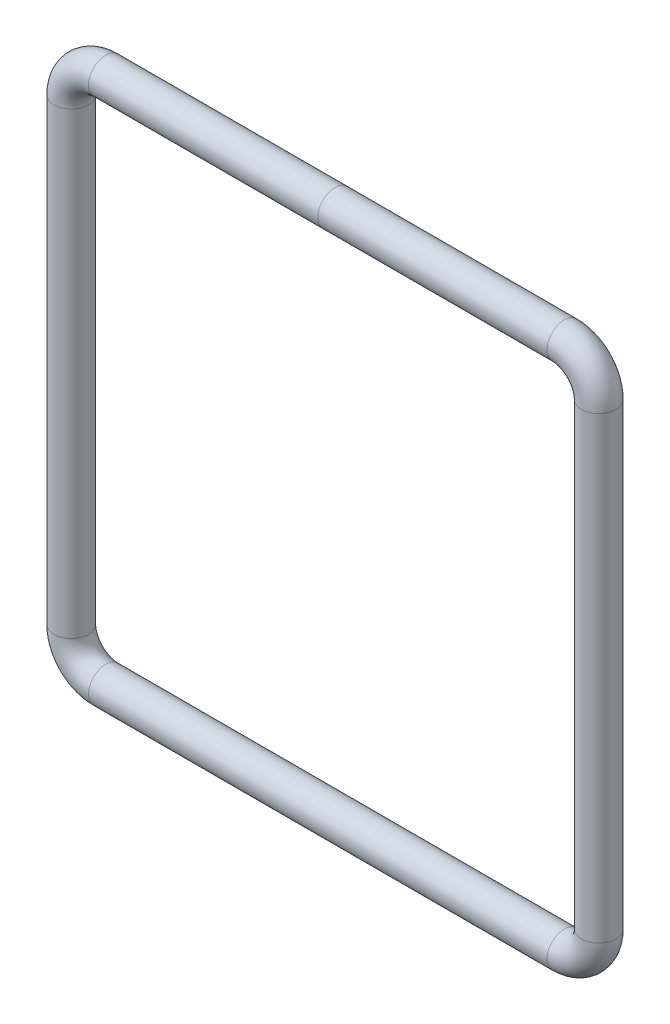
ISO-10303-21;
HEADER;
FILE_DESCRIPTION(('STEP AP214'),'2;1');
FILE_NAME('part.step','',(''),(''),'','','');
FILE_SCHEMA(('AUTOMOTIVE_DESIGN { 1 0 10303 214 1 1 1 1 }'));
ENDSEC;
DATA;
#1=APPLICATION_CONTEXT('core data for automotive mechanical design processes');
#2=APPLICATION_PROTOCOL_DEFINITION('international standard','automotive_design',2000,#1);
#3=PRODUCT_CONTEXT('',#1,'mechanical');
#4=PRODUCT('Part','Part','',(#3));
#5=PRODUCT_RELATED_PRODUCT_CATEGORY('part','',(#4));
#6=PRODUCT_DEFINITION_FORMATION('','',#4);
#7=PRODUCT_DEFINITION_CONTEXT('part definition',#1,'design');
#8=PRODUCT_DEFINITION('design','',#6,#7);
#9=PRODUCT_DEFINITION_SHAPE('','',#8);
#10=(LENGTH_UNIT() NAMED_UNIT(*) SI_UNIT(.MILLI.,.METRE.));
#11=(NAMED_UNIT(*) PLANE_ANGLE_UNIT() SI_UNIT($,.RADIAN.));
#12=(NAMED_UNIT(*) SI_UNIT($,.STERADIAN.) SOLID_ANGLE_UNIT());
#13=UNCERTAINTY_MEASURE_WITH_UNIT(LENGTH_MEASURE(1.E-05),#10,'distance_accuracy_value','');
#14=(GEOMETRIC_REPRESENTATION_CONTEXT(3) GLOBAL_UNCERTAINTY_ASSIGNED_CONTEXT((#13)) GLOBAL_UNIT_ASSIGNED_CONTEXT((#10,
#11,#12)) REPRESENTATION_CONTEXT('',''));
#15=CARTESIAN_POINT('',(0.,0.,0.));
#16=DIRECTION('',(0.,0.,1.));
#17=DIRECTION('',(1.,0.,0.));
#18=AXIS2_PLACEMENT_3D('',#15,#16,#17);
#19=CARTESIAN_POINT('',(-27.9,32.1,0.));
#20=DIRECTION('',(1.,0.,0.));
#21=DIRECTION('',(0.,0.,-1.));
#22=AXIS2_PLACEMENT_3D('',#19,#20,#21);
#23=CYLINDRICAL_SURFACE('',#22,2.1);
#24=CARTESIAN_POINT('',(0.,32.1,0.));
#25=DIRECTION('',(1.,0.,0.));
#26=DIRECTION('',(0.,0.,-1.));
#27=AXIS2_PLACEMENT_3D('',#24,#25,#26);
#28=CIRCLE('',#27,2.1);
#29=CARTESIAN_POINT('',(0.,32.1,-2.1));
#30=VERTEX_POINT('',#29);
#31=EDGE_CURVE('E63',#30,#30,#28,.T.);
#32=ORIENTED_EDGE('',*,*,#31,.F.);
#33=EDGE_LOOP('',(#32));
#34=FACE_BOUND('',#33,.T.);
#35=CARTESIAN_POINT('',(-27.9,32.1,0.));
#36=DIRECTION('',(1.,0.,0.));
#37=DIRECTION('',(0.,0.,-1.));
#38=AXIS2_PLACEMENT_3D('',#35,#36,#37);
#39=CIRCLE('',#38,2.1);
#40=CARTESIAN_POINT('',(-27.9,34.2,0.));
#41=VERTEX_POINT('',#40);
#42=EDGE_CURVE('E10',#41,#41,#39,.T.);
#43=ORIENTED_EDGE('',*,*,#42,.T.);
#44=EDGE_LOOP('',(#43));
#45=FACE_BOUND('',#44,.T.);
#46=ADVANCED_FACE('F32',(#34,#45),#23,.T.);
#47=CARTESIAN_POINT('',(-27.9,27.9,0.));
#48=DIRECTION('',(0.,0.,-1.));
#49=DIRECTION('',(-1.,0.,0.));
#50=AXIS2_PLACEMENT_3D('',#47,#48,#49);
#51=TOROIDAL_SURFACE('',#50,4.2,2.1);
#52=CARTESIAN_POINT('',(-32.1,27.9,0.));
#53=DIRECTION('',(0.,1.,0.));
#54=DIRECTION('',(0.,0.,-1.));
#55=AXIS2_PLACEMENT_3D('',#52,#53,#54);
#56=CIRCLE('',#55,2.1);
#57=CARTESIAN_POINT('',(-34.2,27.9,0.));
#58=VERTEX_POINT('',#57);
#59=EDGE_CURVE('E38',#58,#58,#56,.T.);
#60=CARTESIAN_POINT('',(-27.9,27.9,0.));
#61=DIRECTION('',(0.,0.,-1.));
#62=DIRECTION('',(-1.,0.,0.));
#63=AXIS2_PLACEMENT_3D('',#60,#61,#62);
#64=CIRCLE('',#63,6.3);
#65=EDGE_CURVE('',#58,#41,#64,.T.);
#66=ORIENTED_EDGE('',*,*,#59,.T.);
#67=ORIENTED_EDGE('',*,*,#42,.F.);
#68=ORIENTED_EDGE('',*,*,#65,.T.);
#69=ORIENTED_EDGE('',*,*,#65,.F.);
#70=EDGE_LOOP('',(#66,#68,#67,#69));
#71=FACE_BOUND('',#70,.T.);
#72=ADVANCED_FACE('F70',(#71),#51,.T.);
#73=CARTESIAN_POINT('',(-32.1,-27.9,0.));
#74=DIRECTION('',(0.,1.,0.));
#75=DIRECTION('',(0.,0.,1.));
#76=AXIS2_PLACEMENT_3D('',#73,#74,#75);
#77=CYLINDRICAL_SURFACE('',#76,2.1);
#78=ORIENTED_EDGE('',*,*,#59,.F.);
#79=EDGE_LOOP('',(#78));
#80=FACE_BOUND('',#79,.T.);
#81=CARTESIAN_POINT('',(-32.1,-27.9,0.));
#82=DIRECTION('',(0.,1.,0.));
#83=DIRECTION('',(0.,0.,-1.));
#84=AXIS2_PLACEMENT_3D('',#81,#82,#83);
#85=CIRCLE('',#84,2.1);
#86=CARTESIAN_POINT('',(-34.2,-27.9,0.));
#87=VERTEX_POINT('',#86);
#88=EDGE_CURVE('E42',#87,#87,#85,.T.);
#89=ORIENTED_EDGE('',*,*,#88,.T.);
#90=EDGE_LOOP('',(#89));
#91=FACE_BOUND('',#90,.T.);
#92=ADVANCED_FACE('F74',(#80,#91),#77,.T.);
#93=CARTESIAN_POINT('',(-27.9,-27.9,0.));
#94=DIRECTION('',(0.,0.,-1.));
#95=DIRECTION('',(-1.,0.,0.));
#96=AXIS2_PLACEMENT_3D('',#93,#94,#95);
#97=TOROIDAL_SURFACE('',#96,4.2,2.1);
#98=CARTESIAN_POINT('',(-27.9,-32.1,0.));
#99=DIRECTION('',(-1.,0.,0.));
#100=DIRECTION('',(0.,0.,-1.));
#101=AXIS2_PLACEMENT_3D('',#98,#99,#100);
#102=CIRCLE('',#101,2.1);
#103=CARTESIAN_POINT('',(-27.9,-34.2,0.));
#104=VERTEX_POINT('',#103);
#105=EDGE_CURVE('E46',#104,#104,#102,.T.);
#106=CARTESIAN_POINT('',(-27.9,-27.9,0.));
#107=DIRECTION('',(0.,0.,-1.));
#108=DIRECTION('',(-1.,0.,0.));
#109=AXIS2_PLACEMENT_3D('',#106,#107,#108);
#110=CIRCLE('',#109,6.3);
#111=EDGE_CURVE('',#104,#87,#110,.T.);
#112=ORIENTED_EDGE('',*,*,#105,.T.);
#113=ORIENTED_EDGE('',*,*,#88,.F.);
#114=ORIENTED_EDGE('',*,*,#111,.T.);
#115=ORIENTED_EDGE('',*,*,#111,.F.);
#116=EDGE_LOOP('',(#112,#114,#113,#115));
#117=FACE_BOUND('',#116,.T.);
#118=ADVANCED_FACE('F79',(#117),#97,.T.);
#119=CARTESIAN_POINT('',(27.9,-32.1,0.));
#120=DIRECTION('',(-1.,0.,0.));
#121=DIRECTION('',(0.,0.,1.));
#122=AXIS2_PLACEMENT_3D('',#119,#120,#121);
#123=CYLINDRICAL_SURFACE('',#122,2.1);
#124=ORIENTED_EDGE('',*,*,#105,.F.);
#125=EDGE_LOOP('',(#124));
#126=FACE_BOUND('',#125,.T.);
#127=CARTESIAN_POINT('',(27.9,-32.1,0.));
#128=DIRECTION('',(-1.,0.,0.));
#129=DIRECTION('',(0.,0.,-1.));
#130=AXIS2_PLACEMENT_3D('',#127,#128,#129);
#131=CIRCLE('',#130,2.1);
#132=CARTESIAN_POINT('',(27.9,-34.2,0.));
#133=VERTEX_POINT('',#132);
#134=EDGE_CURVE('E51',#133,#133,#131,.T.);
#135=ORIENTED_EDGE('',*,*,#134,.T.);
#136=EDGE_LOOP('',(#135));
#137=FACE_BOUND('',#136,.T.);
#138=ADVANCED_FACE('F85',(#126,#137),#123,.T.);
#139=CARTESIAN_POINT('',(27.9,-27.9,0.));
#140=DIRECTION('',(0.,0.,-1.));
#141=DIRECTION('',(-1.,0.,0.));
#142=AXIS2_PLACEMENT_3D('',#139,#140,#141);
#143=TOROIDAL_SURFACE('',#142,4.2,2.1);
#144=CARTESIAN_POINT('',(32.1,-27.9,0.));
#145=DIRECTION('',(0.,-1.,0.));
#146=DIRECTION('',(0.,0.,-1.));
#147=AXIS2_PLACEMENT_3D('',#144,#145,#146);
#148=CIRCLE('',#147,2.1);
#149=CARTESIAN_POINT('',(34.2,-27.9,0.));
#150=VERTEX_POINT('',#149);
#151=EDGE_CURVE('E54',#150,#150,#148,.T.);
#152=CARTESIAN_POINT('',(27.9,-27.9,0.));
#153=DIRECTION('',(0.,0.,-1.));
#154=DIRECTION('',(-1.,0.,0.));
#155=AXIS2_PLACEMENT_3D('',#152,#153,#154);
#156=CIRCLE('',#155,6.3);
#157=EDGE_CURVE('',#150,#133,#156,.T.);
#158=ORIENTED_EDGE('',*,*,#151,.T.);
#159=ORIENTED_EDGE('',*,*,#134,.F.);
#160=ORIENTED_EDGE('',*,*,#157,.T.);
#161=ORIENTED_EDGE('',*,*,#157,.F.);
#162=EDGE_LOOP('',(#158,#160,#159,#161));
#163=FACE_BOUND('',#162,.T.);
#164=ADVANCED_FACE('F89',(#163),#143,.T.);
#165=CARTESIAN_POINT('',(32.1,27.9,0.));
#166=DIRECTION('',(0.,-1.,0.));
#167=DIRECTION('',(0.,0.,-1.));
#168=AXIS2_PLACEMENT_3D('',#165,#166,#167);
#169=CYLINDRICAL_SURFACE('',#168,2.1);
#170=ORIENTED_EDGE('',*,*,#151,.F.);
#171=EDGE_LOOP('',(#170));
#172=FACE_BOUND('',#171,.T.);
#173=CARTESIAN_POINT('',(32.1,27.9,0.));
#174=DIRECTION('',(0.,-1.,0.));
#175=DIRECTION('',(0.,0.,-1.));
#176=AXIS2_PLACEMENT_3D('',#173,#174,#175);
#177=CIRCLE('',#176,2.1);
#178=CARTESIAN_POINT('',(34.2,27.9,0.));
#179=VERTEX_POINT('',#178);
#180=EDGE_CURVE('E57',#179,#179,#177,.T.);
#181=ORIENTED_EDGE('',*,*,#180,.T.);
#182=EDGE_LOOP('',(#181));
#183=FACE_BOUND('',#182,.T.);
#184=ADVANCED_FACE('F93',(#172,#183),#169,.T.);
#185=CARTESIAN_POINT('',(27.9,27.9,0.));
#186=DIRECTION('',(0.,0.,-1.));
#187=DIRECTION('',(-1.,0.,0.));
#188=AXIS2_PLACEMENT_3D('',#185,#186,#187);
#189=TOROIDAL_SURFACE('',#188,4.2,2.1);
#190=CARTESIAN_POINT('',(27.9,32.1,0.));
#191=DIRECTION('',(1.,0.,0.));
#192=DIRECTION('',(0.,0.,-1.));
#193=AXIS2_PLACEMENT_3D('',#190,#191,#192);
#194=CIRCLE('',#193,2.1);
#195=CARTESIAN_POINT('',(27.9,34.2,0.));
#196=VERTEX_POINT('',#195);
#197=EDGE_CURVE('E60',#196,#196,#194,.T.);
#198=CARTESIAN_POINT('',(27.9,27.9,0.));
#199=DIRECTION('',(0.,0.,-1.));
#200=DIRECTION('',(-1.,0.,0.));
#201=AXIS2_PLACEMENT_3D('',#198,#199,#200);
#202=CIRCLE('',#201,6.3);
#203=EDGE_CURVE('',#196,#179,#202,.T.);
#204=ORIENTED_EDGE('',*,*,#197,.T.);
#205=ORIENTED_EDGE('',*,*,#180,.F.);
#206=ORIENTED_EDGE('',*,*,#203,.T.);
#207=ORIENTED_EDGE('',*,*,#203,.F.);
#208=EDGE_LOOP('',(#204,#206,#205,#207));
#209=FACE_BOUND('',#208,.T.);
#210=ADVANCED_FACE('F97',(#209),#189,.T.);
#211=CARTESIAN_POINT('',(0.,32.1,0.));
#212=DIRECTION('',(1.,0.,0.));
#213=DIRECTION('',(0.,0.,-1.));
#214=AXIS2_PLACEMENT_3D('',#211,#212,#213);
#215=CYLINDRICAL_SURFACE('',#214,2.1);
#216=ORIENTED_EDGE('',*,*,#197,.F.);
#217=EDGE_LOOP('',(#216));
#218=FACE_BOUND('',#217,.T.);
#219=ORIENTED_EDGE('',*,*,#31,.T.);
#220=EDGE_LOOP('',(#219));
#221=FACE_BOUND('',#220,.T.);
#222=ADVANCED_FACE('F67',(#218,#221),#215,.T.);
#223=CLOSED_SHELL('',(#46,#72,#92,#118,#138,#164,#184,#210,#222));
#224=MANIFOLD_SOLID_BREP('B2',#223);
#225=ADVANCED_BREP_SHAPE_REPRESENTATION('',(#18,#224),#14);
#226=SHAPE_DEFINITION_REPRESENTATION(#9,#225);
ENDSEC;
END-ISO-10303-21;
